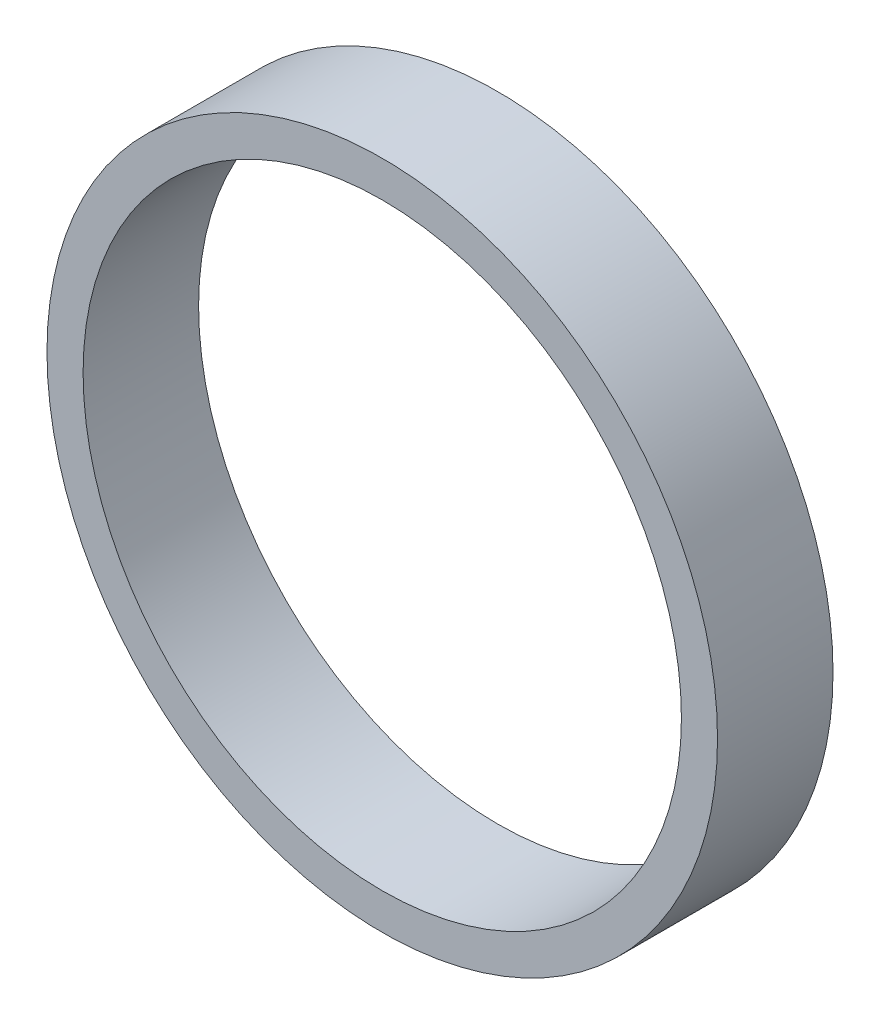
ISO-10303-21;
HEADER;
FILE_DESCRIPTION(('STEP AP214'),'2;1');
FILE_NAME('part.step','',(''),(''),'','','');
FILE_SCHEMA(('AUTOMOTIVE_DESIGN { 1 0 10303 214 1 1 1 1 }'));
ENDSEC;
DATA;
#1=APPLICATION_CONTEXT('core data for automotive mechanical design processes');
#2=APPLICATION_PROTOCOL_DEFINITION('international standard','automotive_design',2000,#1);
#3=PRODUCT_CONTEXT('',#1,'mechanical');
#4=PRODUCT('Part','Part','',(#3));
#5=PRODUCT_RELATED_PRODUCT_CATEGORY('part','',(#4));
#6=PRODUCT_DEFINITION_FORMATION('','',#4);
#7=PRODUCT_DEFINITION_CONTEXT('part definition',#1,'design');
#8=PRODUCT_DEFINITION('design','',#6,#7);
#9=PRODUCT_DEFINITION_SHAPE('','',#8);
#10=(LENGTH_UNIT() NAMED_UNIT(*) SI_UNIT(.MILLI.,.METRE.));
#11=(NAMED_UNIT(*) PLANE_ANGLE_UNIT() SI_UNIT($,.RADIAN.));
#12=(NAMED_UNIT(*) SI_UNIT($,.STERADIAN.) SOLID_ANGLE_UNIT());
#13=UNCERTAINTY_MEASURE_WITH_UNIT(LENGTH_MEASURE(1.E-05),#10,'distance_accuracy_value','');
#14=(GEOMETRIC_REPRESENTATION_CONTEXT(3) GLOBAL_UNCERTAINTY_ASSIGNED_CONTEXT((#13)) GLOBAL_UNIT_ASSIGNED_CONTEXT((#10,
#11,#12)) REPRESENTATION_CONTEXT('',''));
#15=CARTESIAN_POINT('',(0.,0.,0.));
#16=DIRECTION('',(0.,0.,1.));
#17=DIRECTION('',(1.,0.,0.));
#18=AXIS2_PLACEMENT_3D('',#15,#16,#17);
#19=CARTESIAN_POINT('',(-4.466563938901,-3.537662629018,0.));
#20=DIRECTION('',(0.,0.,1.));
#21=DIRECTION('',(-1.,0.,0.));
#22=AXIS2_PLACEMENT_3D('',#19,#20,#21);
#23=CYLINDRICAL_SURFACE('',#22,0.259027002927703);
#24=CARTESIAN_POINT('',(-4.207536935973,-3.537662629018,0.));
#25=CARTESIAN_POINT('',(-4.207536935973,-3.537662629018,0.1));
#26=B_SPLINE_CURVE_WITH_KNOTS('',1,(#24,#25),.UNSPECIFIED.,.F.,.F.,(2,2),(0.,0.1),.UNSPECIFIED.);
#27=CARTESIAN_POINT('',(-4.207536935973,-3.537662629018,0.));
#28=VERTEX_POINT('',#27);
#29=CARTESIAN_POINT('',(-4.207536935973,-3.537662629018,0.1));
#30=VERTEX_POINT('',#29);
#31=EDGE_CURVE('E11',#28,#30,#26,.T.);
#32=ORIENTED_EDGE('',*,*,#31,.F.);
#33=CARTESIAN_POINT('',(-4.466563938901,-3.537662629018,0.));
#34=DIRECTION('',(0.,0.,1.));
#35=DIRECTION('',(-1.,0.,0.));
#36=AXIS2_PLACEMENT_3D('',#33,#34,#35);
#37=CIRCLE('',#36,0.259027002927703);
#38=EDGE_CURVE('E26',#28,#28,#37,.T.);
#39=ORIENTED_EDGE('',*,*,#38,.F.);
#40=ORIENTED_EDGE('',*,*,#31,.T.);
#41=CARTESIAN_POINT('',(-4.466563938901,-3.537662629018,0.1));
#42=DIRECTION('',(0.,0.,-1.));
#43=DIRECTION('',(-1.,0.,0.));
#44=AXIS2_PLACEMENT_3D('',#41,#42,#43);
#45=CIRCLE('',#44,0.259027002927703);
#46=EDGE_CURVE('E36',#30,#30,#45,.T.);
#47=ORIENTED_EDGE('',*,*,#46,.F.);
#48=EDGE_LOOP('',(#32,#39,#40,#47));
#49=FACE_BOUND('',#48,.T.);
#50=ADVANCED_FACE('F17',(#49),#23,.F.);
#51=CARTESIAN_POINT('',(-4.466563938901,-3.537662629018,0.));
#52=DIRECTION('',(0.,0.,1.));
#53=DIRECTION('',(-1.,0.,0.));
#54=AXIS2_PLACEMENT_3D('',#51,#52,#53);
#55=CYLINDRICAL_SURFACE('',#54,0.290297946747656);
#56=CARTESIAN_POINT('',(-4.466563938901,-3.537662629018,0.1));
#57=DIRECTION('',(0.,0.,1.));
#58=DIRECTION('',(-1.,0.,0.));
#59=AXIS2_PLACEMENT_3D('',#56,#57,#58);
#60=CIRCLE('',#59,0.290297946747656);
#61=CARTESIAN_POINT('',(-4.176265992153,-3.537662629018,0.1));
#62=VERTEX_POINT('',#61);
#63=EDGE_CURVE('E50',#62,#62,#60,.T.);
#64=ORIENTED_EDGE('',*,*,#63,.F.);
#65=CARTESIAN_POINT('',(-4.176265992153,-3.537662629018,0.));
#66=CARTESIAN_POINT('',(-4.176265992153,-3.537662629018,0.1));
#67=B_SPLINE_CURVE_WITH_KNOTS('',1,(#65,#66),.UNSPECIFIED.,.F.,.F.,(2,2),(0.,0.1),.UNSPECIFIED.);
#68=CARTESIAN_POINT('',(-4.176265992153,-3.537662629018,0.));
#69=VERTEX_POINT('',#68);
#70=EDGE_CURVE('E46',#69,#62,#67,.T.);
#71=ORIENTED_EDGE('',*,*,#70,.F.);
#72=CARTESIAN_POINT('',(-4.466563938901,-3.537662629018,0.));
#73=DIRECTION('',(0.,0.,-1.));
#74=DIRECTION('',(-1.,0.,0.));
#75=AXIS2_PLACEMENT_3D('',#72,#73,#74);
#76=CIRCLE('',#75,0.290297946747656);
#77=EDGE_CURVE('E49',#69,#69,#76,.T.);
#78=ORIENTED_EDGE('',*,*,#77,.F.);
#79=ORIENTED_EDGE('',*,*,#70,.T.);
#80=EDGE_LOOP('',(#64,#71,#78,#79));
#81=FACE_BOUND('',#80,.T.);
#82=ADVANCED_FACE('F48',(#81),#55,.T.);
#83=CARTESIAN_POINT('',(-4.466563938901,-3.537662629018,0.));
#84=DIRECTION('',(0.,0.,1.));
#85=DIRECTION('',(1.,0.,0.));
#86=AXIS2_PLACEMENT_3D('',#83,#84,#85);
#87=PLANE('',#86);
#88=ORIENTED_EDGE('',*,*,#77,.T.);
#89=EDGE_LOOP('',(#88));
#90=FACE_BOUND('',#89,.T.);
#91=ORIENTED_EDGE('',*,*,#38,.T.);
#92=EDGE_LOOP('',(#91));
#93=FACE_BOUND('',#92,.T.);
#94=ADVANCED_FACE('F53',(#90,#93),#87,.F.);
#95=CARTESIAN_POINT('',(-4.466563938901,-3.537662629018,0.1));
#96=DIRECTION('',(0.,0.,1.));
#97=DIRECTION('',(1.,0.,0.));
#98=AXIS2_PLACEMENT_3D('',#95,#96,#97);
#99=PLANE('',#98);
#100=ORIENTED_EDGE('',*,*,#63,.T.);
#101=EDGE_LOOP('',(#100));
#102=FACE_BOUND('',#101,.T.);
#103=ORIENTED_EDGE('',*,*,#46,.T.);
#104=EDGE_LOOP('',(#103));
#105=FACE_BOUND('',#104,.T.);
#106=ADVANCED_FACE('F71',(#102,#105),#99,.T.);
#107=CLOSED_SHELL('',(#50,#82,#94,#106));
#108=MANIFOLD_SOLID_BREP('B1',#107);
#109=ADVANCED_BREP_SHAPE_REPRESENTATION('',(#18,#108),#14);
#110=SHAPE_DEFINITION_REPRESENTATION(#9,#109);
ENDSEC;
END-ISO-10303-21;
